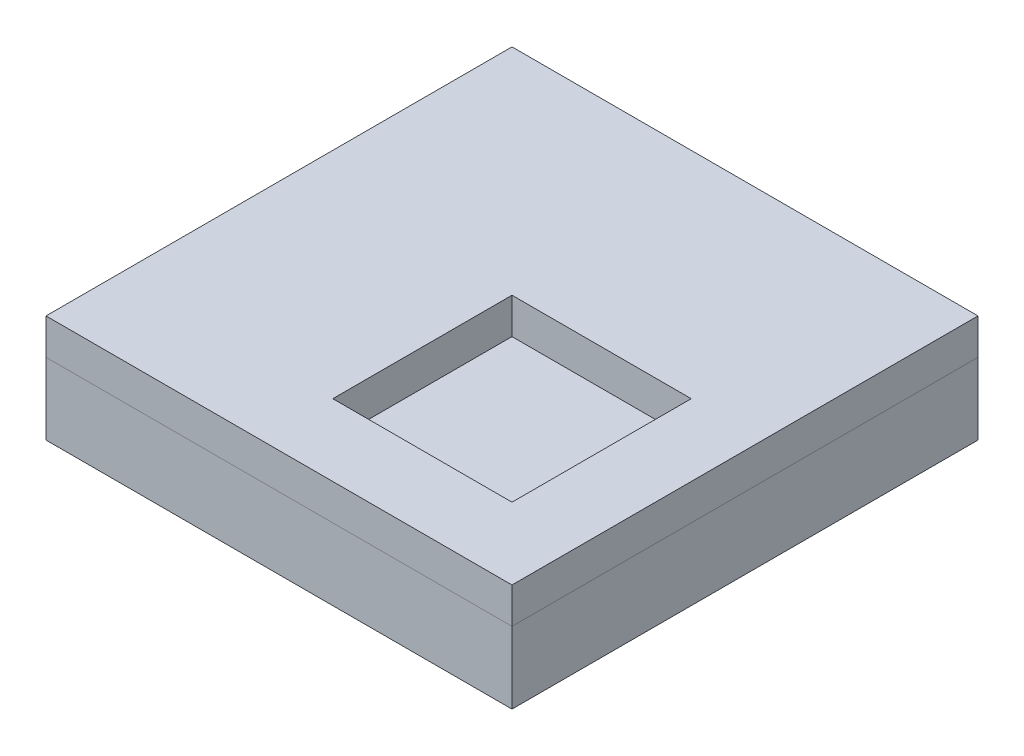
ISO-10303-21;
HEADER;
FILE_DESCRIPTION(('STEP AP214'),'2;1');
FILE_NAME('part.step','',(''),(''),'','','');
FILE_SCHEMA(('AUTOMOTIVE_DESIGN { 1 0 10303 214 1 1 1 1 }'));
ENDSEC;
DATA;
#1=APPLICATION_CONTEXT('core data for automotive mechanical design processes');
#2=APPLICATION_PROTOCOL_DEFINITION('international standard','automotive_design',2000,#1);
#3=PRODUCT_CONTEXT('',#1,'mechanical');
#4=PRODUCT('Part','Part','',(#3));
#5=PRODUCT_RELATED_PRODUCT_CATEGORY('part','',(#4));
#6=PRODUCT_DEFINITION_FORMATION('','',#4);
#7=PRODUCT_DEFINITION_CONTEXT('part definition',#1,'design');
#8=PRODUCT_DEFINITION('design','',#6,#7);
#9=PRODUCT_DEFINITION_SHAPE('','',#8);
#10=(LENGTH_UNIT() NAMED_UNIT(*) SI_UNIT(.MILLI.,.METRE.));
#11=(NAMED_UNIT(*) PLANE_ANGLE_UNIT() SI_UNIT($,.RADIAN.));
#12=(NAMED_UNIT(*) SI_UNIT($,.STERADIAN.) SOLID_ANGLE_UNIT());
#13=UNCERTAINTY_MEASURE_WITH_UNIT(LENGTH_MEASURE(1.E-05),#10,'distance_accuracy_value','');
#14=(GEOMETRIC_REPRESENTATION_CONTEXT(3) GLOBAL_UNCERTAINTY_ASSIGNED_CONTEXT((#13)) GLOBAL_UNIT_ASSIGNED_CONTEXT((#10,
#11,#12)) REPRESENTATION_CONTEXT('',''));
#15=CARTESIAN_POINT('',(0.,0.,0.));
#16=DIRECTION('',(0.,0.,1.));
#17=DIRECTION('',(1.,0.,0.));
#18=AXIS2_PLACEMENT_3D('',#15,#16,#17);
#19=CARTESIAN_POINT('',(0.,3.,0.));
#20=DIRECTION('',(0.,1.,0.));
#21=DIRECTION('',(0.,0.,1.));
#22=AXIS2_PLACEMENT_3D('',#19,#20,#21);
#23=PLANE('',#22);
#24=DIRECTION('',(0.,0.,1.));
#25=VECTOR('',#24,1.);
#26=CARTESIAN_POINT('',(-6.5,3.,6.5));
#27=LINE('',#26,#25);
#28=CARTESIAN_POINT('',(-6.5,3.,-6.5));
#29=VERTEX_POINT('',#28);
#30=CARTESIAN_POINT('',(-6.5,3.,6.5));
#31=VERTEX_POINT('',#30);
#32=EDGE_CURVE('E145',#29,#31,#27,.T.);
#33=ORIENTED_EDGE('',*,*,#32,.T.);
#34=DIRECTION('',(1.,0.,0.));
#35=VECTOR('',#34,1.);
#36=CARTESIAN_POINT('',(6.5,3.,6.5));
#37=LINE('',#36,#35);
#38=CARTESIAN_POINT('',(6.5,3.,6.5));
#39=VERTEX_POINT('',#38);
#40=EDGE_CURVE('E148',#31,#39,#37,.T.);
#41=ORIENTED_EDGE('',*,*,#40,.T.);
#42=DIRECTION('',(0.,0.,-1.));
#43=VECTOR('',#42,1.);
#44=CARTESIAN_POINT('',(6.5,3.,6.5));
#45=LINE('',#44,#43);
#46=CARTESIAN_POINT('',(6.5,3.,-6.5));
#47=VERTEX_POINT('',#46);
#48=EDGE_CURVE('E151',#39,#47,#45,.T.);
#49=ORIENTED_EDGE('',*,*,#48,.T.);
#50=DIRECTION('',(-1.,0.,0.));
#51=VECTOR('',#50,1.);
#52=CARTESIAN_POINT('',(6.5,3.,-6.5));
#53=LINE('',#52,#51);
#54=EDGE_CURVE('E153',#47,#29,#53,.T.);
#55=ORIENTED_EDGE('',*,*,#54,.T.);
#56=EDGE_LOOP('',(#33,#41,#49,#55));
#57=FACE_BOUND('',#56,.T.);
#58=DIRECTION('',(1.,0.,0.));
#59=VECTOR('',#58,1.);
#60=CARTESIAN_POINT('',(0.,3.,-0.500000000000001));
#61=LINE('',#60,#59);
#62=CARTESIAN_POINT('',(-0.499999999999999,3.,-0.500000000000001));
#63=VERTEX_POINT('',#62);
#64=CARTESIAN_POINT('',(4.5,3.,-0.500000000000001));
#65=VERTEX_POINT('',#64);
#66=EDGE_CURVE('E117',#63,#65,#61,.T.);
#67=ORIENTED_EDGE('',*,*,#66,.T.);
#68=DIRECTION('',(0.,0.,1.));
#69=VECTOR('',#68,1.);
#70=CARTESIAN_POINT('',(4.5,3.,0.));
#71=LINE('',#70,#69);
#72=CARTESIAN_POINT('',(4.5,3.,4.5));
#73=VERTEX_POINT('',#72);
#74=EDGE_CURVE('E58',#65,#73,#71,.T.);
#75=ORIENTED_EDGE('',*,*,#74,.T.);
#76=DIRECTION('',(-1.,0.,0.));
#77=VECTOR('',#76,1.);
#78=CARTESIAN_POINT('',(0.,3.,4.5));
#79=LINE('',#78,#77);
#80=CARTESIAN_POINT('',(-0.499999999999998,3.,4.5));
#81=VERTEX_POINT('',#80);
#82=EDGE_CURVE('E123',#73,#81,#79,.T.);
#83=ORIENTED_EDGE('',*,*,#82,.T.);
#84=DIRECTION('',(0.,0.,-1.));
#85=VECTOR('',#84,1.);
#86=CARTESIAN_POINT('',(-0.499999999999999,3.,0.));
#87=LINE('',#86,#85);
#88=EDGE_CURVE('E137',#81,#63,#87,.T.);
#89=ORIENTED_EDGE('',*,*,#88,.T.);
#90=EDGE_LOOP('',(#67,#75,#83,#89));
#91=FACE_BOUND('',#90,.T.);
#92=ADVANCED_FACE('F43',(#57,#91),#23,.T.);
#93=CARTESIAN_POINT('',(0.,2.,0.));
#94=DIRECTION('',(0.,1.,0.));
#95=DIRECTION('',(0.,0.,1.));
#96=AXIS2_PLACEMENT_3D('',#93,#94,#95);
#97=PLANE('',#96);
#98=DIRECTION('',(0.,0.,1.));
#99=VECTOR('',#98,1.);
#100=CARTESIAN_POINT('',(-6.5,2.,6.5));
#101=LINE('',#100,#99);
#102=CARTESIAN_POINT('',(-6.5,2.,-6.5));
#103=VERTEX_POINT('',#102);
#104=CARTESIAN_POINT('',(-6.5,2.,6.5));
#105=VERTEX_POINT('',#104);
#106=EDGE_CURVE('E124',#103,#105,#101,.T.);
#107=ORIENTED_EDGE('',*,*,#106,.F.);
#108=DIRECTION('',(-1.,0.,0.));
#109=VECTOR('',#108,1.);
#110=CARTESIAN_POINT('',(6.5,2.,-6.5));
#111=LINE('',#110,#109);
#112=CARTESIAN_POINT('',(6.5,2.,-6.5));
#113=VERTEX_POINT('',#112);
#114=EDGE_CURVE('E149',#113,#103,#111,.T.);
#115=ORIENTED_EDGE('',*,*,#114,.F.);
#116=DIRECTION('',(0.,0.,-1.));
#117=VECTOR('',#116,1.);
#118=CARTESIAN_POINT('',(6.5,2.,6.5));
#119=LINE('',#118,#117);
#120=CARTESIAN_POINT('',(6.5,2.,6.5));
#121=VERTEX_POINT('',#120);
#122=EDGE_CURVE('E160',#121,#113,#119,.T.);
#123=ORIENTED_EDGE('',*,*,#122,.F.);
#124=DIRECTION('',(1.,0.,0.));
#125=VECTOR('',#124,1.);
#126=CARTESIAN_POINT('',(6.5,2.,6.5));
#127=LINE('',#126,#125);
#128=EDGE_CURVE('E158',#105,#121,#127,.T.);
#129=ORIENTED_EDGE('',*,*,#128,.F.);
#130=EDGE_LOOP('',(#107,#115,#123,#129));
#131=FACE_BOUND('',#130,.T.);
#132=DIRECTION('',(0.,0.,1.));
#133=VECTOR('',#132,1.);
#134=CARTESIAN_POINT('',(4.5,2.,0.));
#135=LINE('',#134,#133);
#136=CARTESIAN_POINT('',(4.5,2.,-0.500000000000001));
#137=VERTEX_POINT('',#136);
#138=CARTESIAN_POINT('',(4.5,2.,4.5));
#139=VERTEX_POINT('',#138);
#140=EDGE_CURVE('E108',#137,#139,#135,.T.);
#141=ORIENTED_EDGE('',*,*,#140,.F.);
#142=DIRECTION('',(1.,0.,0.));
#143=VECTOR('',#142,1.);
#144=CARTESIAN_POINT('',(0.,2.,-0.500000000000001));
#145=LINE('',#144,#143);
#146=CARTESIAN_POINT('',(-0.499999999999999,2.,-0.500000000000001));
#147=VERTEX_POINT('',#146);
#148=EDGE_CURVE('E131',#147,#137,#145,.T.);
#149=ORIENTED_EDGE('',*,*,#148,.F.);
#150=DIRECTION('',(0.,0.,-1.));
#151=VECTOR('',#150,1.);
#152=CARTESIAN_POINT('',(-0.499999999999999,2.,0.));
#153=LINE('',#152,#151);
#154=CARTESIAN_POINT('',(-0.499999999999998,2.,4.5));
#155=VERTEX_POINT('',#154);
#156=EDGE_CURVE('E129',#155,#147,#153,.T.);
#157=ORIENTED_EDGE('',*,*,#156,.F.);
#158=DIRECTION('',(-1.,0.,0.));
#159=VECTOR('',#158,1.);
#160=CARTESIAN_POINT('',(0.,2.,4.5));
#161=LINE('',#160,#159);
#162=EDGE_CURVE('E116',#139,#155,#161,.T.);
#163=ORIENTED_EDGE('',*,*,#162,.F.);
#164=EDGE_LOOP('',(#141,#149,#157,#163));
#165=FACE_BOUND('',#164,.T.);
#166=ADVANCED_FACE('F128',(#131,#165),#97,.F.);
#167=CARTESIAN_POINT('',(-6.5,3.,6.5));
#168=DIRECTION('',(1.,0.,0.));
#169=DIRECTION('',(0.,0.,-1.));
#170=AXIS2_PLACEMENT_3D('',#167,#168,#169);
#171=PLANE('',#170);
#172=ORIENTED_EDGE('',*,*,#106,.T.);
#173=DIRECTION('',(0.,-1.,0.));
#174=VECTOR('',#173,1.);
#175=CARTESIAN_POINT('',(-6.5,3.,6.5));
#176=LINE('',#175,#174);
#177=EDGE_CURVE('E12',#31,#105,#176,.T.);
#178=ORIENTED_EDGE('',*,*,#177,.F.);
#179=ORIENTED_EDGE('',*,*,#32,.F.);
#180=DIRECTION('',(0.,-1.,0.));
#181=VECTOR('',#180,1.);
#182=CARTESIAN_POINT('',(-6.5,3.,-6.5));
#183=LINE('',#182,#181);
#184=EDGE_CURVE('E155',#29,#103,#183,.T.);
#185=ORIENTED_EDGE('',*,*,#184,.T.);
#186=EDGE_LOOP('',(#172,#178,#179,#185));
#187=FACE_BOUND('',#186,.T.);
#188=ADVANCED_FACE('F45',(#187),#171,.F.);
#189=CARTESIAN_POINT('',(6.5,3.,6.5));
#190=DIRECTION('',(0.,0.,-1.));
#191=DIRECTION('',(-1.,0.,0.));
#192=AXIS2_PLACEMENT_3D('',#189,#190,#191);
#193=PLANE('',#192);
#194=ORIENTED_EDGE('',*,*,#128,.T.);
#195=DIRECTION('',(0.,-1.,0.));
#196=VECTOR('',#195,1.);
#197=CARTESIAN_POINT('',(6.5,3.,6.5));
#198=LINE('',#197,#196);
#199=EDGE_CURVE('E51',#39,#121,#198,.T.);
#200=ORIENTED_EDGE('',*,*,#199,.F.);
#201=ORIENTED_EDGE('',*,*,#40,.F.);
#202=ORIENTED_EDGE('',*,*,#177,.T.);
#203=EDGE_LOOP('',(#194,#200,#201,#202));
#204=FACE_BOUND('',#203,.T.);
#205=ADVANCED_FACE('F187',(#204),#193,.F.);
#206=CARTESIAN_POINT('',(6.5,3.,6.5));
#207=DIRECTION('',(-1.,0.,0.));
#208=DIRECTION('',(0.,0.,1.));
#209=AXIS2_PLACEMENT_3D('',#206,#207,#208);
#210=PLANE('',#209);
#211=ORIENTED_EDGE('',*,*,#122,.T.);
#212=DIRECTION('',(0.,-1.,0.));
#213=VECTOR('',#212,1.);
#214=CARTESIAN_POINT('',(6.5,3.,-6.5));
#215=LINE('',#214,#213);
#216=EDGE_CURVE('E165',#47,#113,#215,.T.);
#217=ORIENTED_EDGE('',*,*,#216,.F.);
#218=ORIENTED_EDGE('',*,*,#48,.F.);
#219=ORIENTED_EDGE('',*,*,#199,.T.);
#220=EDGE_LOOP('',(#211,#217,#218,#219));
#221=FACE_BOUND('',#220,.T.);
#222=ADVANCED_FACE('F172',(#221),#210,.F.);
#223=CARTESIAN_POINT('',(6.5,3.,-6.5));
#224=DIRECTION('',(0.,0.,1.));
#225=DIRECTION('',(1.,0.,0.));
#226=AXIS2_PLACEMENT_3D('',#223,#224,#225);
#227=PLANE('',#226);
#228=ORIENTED_EDGE('',*,*,#114,.T.);
#229=ORIENTED_EDGE('',*,*,#184,.F.);
#230=ORIENTED_EDGE('',*,*,#54,.F.);
#231=ORIENTED_EDGE('',*,*,#216,.T.);
#232=EDGE_LOOP('',(#228,#229,#230,#231));
#233=FACE_BOUND('',#232,.T.);
#234=ADVANCED_FACE('F180',(#233),#227,.F.);
#235=CARTESIAN_POINT('',(4.5,2.,0.));
#236=DIRECTION('',(-1.,0.,0.));
#237=DIRECTION('',(0.,0.,1.));
#238=AXIS2_PLACEMENT_3D('',#235,#236,#237);
#239=PLANE('',#238);
#240=ORIENTED_EDGE('',*,*,#74,.F.);
#241=DIRECTION('',(0.,1.,0.));
#242=VECTOR('',#241,1.);
#243=CARTESIAN_POINT('',(4.5,2.,-0.500000000000001));
#244=LINE('',#243,#242);
#245=EDGE_CURVE('E112',#137,#65,#244,.T.);
#246=ORIENTED_EDGE('',*,*,#245,.F.);
#247=ORIENTED_EDGE('',*,*,#140,.T.);
#248=DIRECTION('',(0.,1.,0.));
#249=VECTOR('',#248,1.);
#250=CARTESIAN_POINT('',(4.5,2.,4.5));
#251=LINE('',#250,#249);
#252=EDGE_CURVE('E111',#139,#73,#251,.T.);
#253=ORIENTED_EDGE('',*,*,#252,.T.);
#254=EDGE_LOOP('',(#240,#246,#247,#253));
#255=FACE_BOUND('',#254,.T.);
#256=ADVANCED_FACE('F110',(#255),#239,.T.);
#257=CARTESIAN_POINT('',(0.,2.,4.5));
#258=DIRECTION('',(0.,0.,-1.));
#259=DIRECTION('',(-1.,0.,0.));
#260=AXIS2_PLACEMENT_3D('',#257,#258,#259);
#261=PLANE('',#260);
#262=ORIENTED_EDGE('',*,*,#82,.F.);
#263=ORIENTED_EDGE('',*,*,#252,.F.);
#264=ORIENTED_EDGE('',*,*,#162,.T.);
#265=DIRECTION('',(0.,1.,0.));
#266=VECTOR('',#265,1.);
#267=CARTESIAN_POINT('',(-0.499999999999998,2.,4.5));
#268=LINE('',#267,#266);
#269=EDGE_CURVE('E125',#155,#81,#268,.T.);
#270=ORIENTED_EDGE('',*,*,#269,.T.);
#271=EDGE_LOOP('',(#262,#263,#264,#270));
#272=FACE_BOUND('',#271,.T.);
#273=ADVANCED_FACE('F120',(#272),#261,.T.);
#274=CARTESIAN_POINT('',(-0.499999999999999,2.,0.));
#275=DIRECTION('',(1.,0.,0.));
#276=DIRECTION('',(0.,0.,-1.));
#277=AXIS2_PLACEMENT_3D('',#274,#275,#276);
#278=PLANE('',#277);
#279=ORIENTED_EDGE('',*,*,#88,.F.);
#280=ORIENTED_EDGE('',*,*,#269,.F.);
#281=ORIENTED_EDGE('',*,*,#156,.T.);
#282=DIRECTION('',(0.,1.,0.));
#283=VECTOR('',#282,1.);
#284=CARTESIAN_POINT('',(-0.499999999999999,2.,-0.500000000000001));
#285=LINE('',#284,#283);
#286=EDGE_CURVE('E66',#147,#63,#285,.T.);
#287=ORIENTED_EDGE('',*,*,#286,.T.);
#288=EDGE_LOOP('',(#279,#280,#281,#287));
#289=FACE_BOUND('',#288,.T.);
#290=ADVANCED_FACE('F210',(#289),#278,.T.);
#291=CARTESIAN_POINT('',(0.,2.,-0.500000000000001));
#292=DIRECTION('',(0.,0.,1.));
#293=DIRECTION('',(1.,0.,0.));
#294=AXIS2_PLACEMENT_3D('',#291,#292,#293);
#295=PLANE('',#294);
#296=ORIENTED_EDGE('',*,*,#66,.F.);
#297=ORIENTED_EDGE('',*,*,#286,.F.);
#298=ORIENTED_EDGE('',*,*,#148,.T.);
#299=ORIENTED_EDGE('',*,*,#245,.T.);
#300=EDGE_LOOP('',(#296,#297,#298,#299));
#301=FACE_BOUND('',#300,.T.);
#302=ADVANCED_FACE('F214',(#301),#295,.T.);
#303=CLOSED_SHELL('',(#92,#166,#188,#205,#222,#234,#256,#273,#290,#302));
#304=MANIFOLD_SOLID_BREP('B2',#303);
#305=CARTESIAN_POINT('',(6.5,2.,-6.5));
#306=DIRECTION('',(0.,0.,1.));
#307=DIRECTION('',(1.,0.,0.));
#308=AXIS2_PLACEMENT_3D('',#305,#306,#307);
#309=PLANE('',#308);
#310=DIRECTION('',(0.,1.,0.));
#311=VECTOR('',#310,1.);
#312=CARTESIAN_POINT('',(-5.5,2.,-6.5));
#313=LINE('',#312,#311);
#314=CARTESIAN_POINT('',(-5.5,1.,-6.5));
#315=VERTEX_POINT('',#314);
#316=CARTESIAN_POINT('',(-5.5,2.,-6.5));
#317=VERTEX_POINT('',#316);
#318=EDGE_CURVE('E372',#315,#317,#313,.T.);
#319=ORIENTED_EDGE('',*,*,#318,.F.);
#320=DIRECTION('',(-1.,0.,0.));
#321=VECTOR('',#320,1.);
#322=CARTESIAN_POINT('',(6.5,1.,-6.5));
#323=LINE('',#322,#321);
#324=CARTESIAN_POINT('',(5.5,1.,-6.5));
#325=VERTEX_POINT('',#324);
#326=EDGE_CURVE('E41',#325,#315,#323,.T.);
#327=ORIENTED_EDGE('',*,*,#326,.F.);
#328=DIRECTION('',(0.,-1.,0.));
#329=VECTOR('',#328,1.);
#330=CARTESIAN_POINT('',(5.5,2.,-6.5));
#331=LINE('',#330,#329);
#332=CARTESIAN_POINT('',(5.5,2.,-6.5));
#333=VERTEX_POINT('',#332);
#334=EDGE_CURVE('E363',#333,#325,#331,.T.);
#335=ORIENTED_EDGE('',*,*,#334,.F.);
#336=DIRECTION('',(-1.,0.,0.));
#337=VECTOR('',#336,1.);
#338=CARTESIAN_POINT('',(6.5,2.,-6.5));
#339=LINE('',#338,#337);
#340=CARTESIAN_POINT('',(6.5,2.,-6.5));
#341=VERTEX_POINT('',#340);
#342=EDGE_CURVE('E380',#341,#333,#339,.T.);
#343=ORIENTED_EDGE('',*,*,#342,.F.);
#344=DIRECTION('',(0.,-1.,0.));
#345=VECTOR('',#344,1.);
#346=CARTESIAN_POINT('',(6.5,2.,-6.5));
#347=LINE('',#346,#345);
#348=CARTESIAN_POINT('',(6.5,0.,-6.5));
#349=VERTEX_POINT('',#348);
#350=EDGE_CURVE('E392',#341,#349,#347,.T.);
#351=ORIENTED_EDGE('',*,*,#350,.T.);
#352=DIRECTION('',(-1.,0.,0.));
#353=VECTOR('',#352,1.);
#354=CARTESIAN_POINT('',(6.5,0.,-6.5));
#355=LINE('',#354,#353);
#356=CARTESIAN_POINT('',(-6.5,0.,-6.5));
#357=VERTEX_POINT('',#356);
#358=EDGE_CURVE('E319',#349,#357,#355,.T.);
#359=ORIENTED_EDGE('',*,*,#358,.T.);
#360=DIRECTION('',(0.,-1.,0.));
#361=VECTOR('',#360,1.);
#362=CARTESIAN_POINT('',(-6.5,2.,-6.5));
#363=LINE('',#362,#361);
#364=CARTESIAN_POINT('',(-6.5,2.,-6.5));
#365=VERTEX_POINT('',#364);
#366=EDGE_CURVE('E383',#365,#357,#363,.T.);
#367=ORIENTED_EDGE('',*,*,#366,.F.);
#368=EDGE_CURVE('E297',#317,#365,#339,.T.);
#369=ORIENTED_EDGE('',*,*,#368,.F.);
#370=EDGE_LOOP('',(#319,#327,#335,#343,#351,#359,#367,#369));
#371=FACE_BOUND('',#370,.T.);
#372=ADVANCED_FACE('F273',(#371),#309,.F.);
#373=CARTESIAN_POINT('',(0.,2.,0.));
#374=DIRECTION('',(0.,1.,0.));
#375=DIRECTION('',(0.,0.,1.));
#376=AXIS2_PLACEMENT_3D('',#373,#374,#375);
#377=PLANE('',#376);
#378=DIRECTION('',(-1.,0.,0.));
#379=VECTOR('',#378,1.);
#380=CARTESIAN_POINT('',(0.,2.,5.5));
#381=LINE('',#380,#379);
#382=CARTESIAN_POINT('',(5.5,2.,5.5));
#383=VERTEX_POINT('',#382);
#384=CARTESIAN_POINT('',(-5.5,2.,5.5));
#385=VERTEX_POINT('',#384);
#386=EDGE_CURVE('E402',#383,#385,#381,.T.);
#387=ORIENTED_EDGE('',*,*,#386,.T.);
#388=DIRECTION('',(0.,0.,-1.));
#389=VECTOR('',#388,1.);
#390=CARTESIAN_POINT('',(-5.5,2.,0.));
#391=LINE('',#390,#389);
#392=EDGE_CURVE('E281',#385,#317,#391,.T.);
#393=ORIENTED_EDGE('',*,*,#392,.T.);
#394=ORIENTED_EDGE('',*,*,#368,.T.);
#395=DIRECTION('',(0.,0.,1.));
#396=VECTOR('',#395,1.);
#397=CARTESIAN_POINT('',(-6.5,2.,6.5));
#398=LINE('',#397,#396);
#399=CARTESIAN_POINT('',(-6.5,2.,6.5));
#400=VERTEX_POINT('',#399);
#401=EDGE_CURVE('E375',#365,#400,#398,.T.);
#402=ORIENTED_EDGE('',*,*,#401,.T.);
#403=DIRECTION('',(1.,0.,0.));
#404=VECTOR('',#403,1.);
#405=CARTESIAN_POINT('',(6.5,2.,6.5));
#406=LINE('',#405,#404);
#407=CARTESIAN_POINT('',(6.5,2.,6.5));
#408=VERTEX_POINT('',#407);
#409=EDGE_CURVE('E327',#400,#408,#406,.T.);
#410=ORIENTED_EDGE('',*,*,#409,.T.);
#411=DIRECTION('',(0.,0.,-1.));
#412=VECTOR('',#411,1.);
#413=CARTESIAN_POINT('',(6.5,2.,6.5));
#414=LINE('',#413,#412);
#415=EDGE_CURVE('E378',#408,#341,#414,.T.);
#416=ORIENTED_EDGE('',*,*,#415,.T.);
#417=ORIENTED_EDGE('',*,*,#342,.T.);
#418=DIRECTION('',(0.,0.,1.));
#419=VECTOR('',#418,1.);
#420=CARTESIAN_POINT('',(5.5,2.,0.));
#421=LINE('',#420,#419);
#422=EDGE_CURVE('E399',#333,#383,#421,.T.);
#423=ORIENTED_EDGE('',*,*,#422,.T.);
#424=EDGE_LOOP('',(#387,#393,#394,#402,#410,#416,#417,#423));
#425=FACE_BOUND('',#424,.T.);
#426=ADVANCED_FACE('F403',(#425),#377,.T.);
#427=CARTESIAN_POINT('',(-6.5,2.,6.5));
#428=DIRECTION('',(1.,0.,0.));
#429=DIRECTION('',(0.,0.,-1.));
#430=AXIS2_PLACEMENT_3D('',#427,#428,#429);
#431=PLANE('',#430);
#432=DIRECTION('',(0.,0.,1.));
#433=VECTOR('',#432,1.);
#434=CARTESIAN_POINT('',(-6.5,0.,6.5));
#435=LINE('',#434,#433);
#436=CARTESIAN_POINT('',(-6.5,0.,6.5));
#437=VERTEX_POINT('',#436);
#438=EDGE_CURVE('E374',#357,#437,#435,.T.);
#439=ORIENTED_EDGE('',*,*,#438,.T.);
#440=DIRECTION('',(0.,-1.,0.));
#441=VECTOR('',#440,1.);
#442=CARTESIAN_POINT('',(-6.5,2.,6.5));
#443=LINE('',#442,#441);
#444=EDGE_CURVE('E397',#400,#437,#443,.T.);
#445=ORIENTED_EDGE('',*,*,#444,.F.);
#446=ORIENTED_EDGE('',*,*,#401,.F.);
#447=ORIENTED_EDGE('',*,*,#366,.T.);
#448=EDGE_LOOP('',(#439,#445,#446,#447));
#449=FACE_BOUND('',#448,.T.);
#450=ADVANCED_FACE('F275',(#449),#431,.F.);
#451=CARTESIAN_POINT('',(6.5,2.,6.5));
#452=DIRECTION('',(0.,0.,-1.));
#453=DIRECTION('',(-1.,0.,0.));
#454=AXIS2_PLACEMENT_3D('',#451,#452,#453);
#455=PLANE('',#454);
#456=DIRECTION('',(1.,0.,0.));
#457=VECTOR('',#456,1.);
#458=CARTESIAN_POINT('',(6.5,0.,6.5));
#459=LINE('',#458,#457);
#460=CARTESIAN_POINT('',(6.5,0.,6.5));
#461=VERTEX_POINT('',#460);
#462=EDGE_CURVE('E386',#437,#461,#459,.T.);
#463=ORIENTED_EDGE('',*,*,#462,.T.);
#464=DIRECTION('',(0.,-1.,0.));
#465=VECTOR('',#464,1.);
#466=CARTESIAN_POINT('',(6.5,2.,6.5));
#467=LINE('',#466,#465);
#468=EDGE_CURVE('E394',#408,#461,#467,.T.);
#469=ORIENTED_EDGE('',*,*,#468,.F.);
#470=ORIENTED_EDGE('',*,*,#409,.F.);
#471=ORIENTED_EDGE('',*,*,#444,.T.);
#472=EDGE_LOOP('',(#463,#469,#470,#471));
#473=FACE_BOUND('',#472,.T.);
#474=ADVANCED_FACE('F410',(#473),#455,.F.);
#475=CARTESIAN_POINT('',(6.5,2.,6.5));
#476=DIRECTION('',(-1.,0.,0.));
#477=DIRECTION('',(0.,0.,1.));
#478=AXIS2_PLACEMENT_3D('',#475,#476,#477);
#479=PLANE('',#478);
#480=DIRECTION('',(0.,0.,-1.));
#481=VECTOR('',#480,1.);
#482=CARTESIAN_POINT('',(6.5,0.,6.5));
#483=LINE('',#482,#481);
#484=EDGE_CURVE('E388',#461,#349,#483,.T.);
#485=ORIENTED_EDGE('',*,*,#484,.T.);
#486=ORIENTED_EDGE('',*,*,#350,.F.);
#487=ORIENTED_EDGE('',*,*,#415,.F.);
#488=ORIENTED_EDGE('',*,*,#468,.T.);
#489=EDGE_LOOP('',(#485,#486,#487,#488));
#490=FACE_BOUND('',#489,.T.);
#491=ADVANCED_FACE('F413',(#490),#479,.F.);
#492=CARTESIAN_POINT('',(0.,0.,0.));
#493=DIRECTION('',(0.,1.,0.));
#494=DIRECTION('',(0.,0.,1.));
#495=AXIS2_PLACEMENT_3D('',#492,#493,#494);
#496=PLANE('',#495);
#497=ORIENTED_EDGE('',*,*,#438,.F.);
#498=ORIENTED_EDGE('',*,*,#358,.F.);
#499=ORIENTED_EDGE('',*,*,#484,.F.);
#500=ORIENTED_EDGE('',*,*,#462,.F.);
#501=EDGE_LOOP('',(#497,#498,#499,#500));
#502=FACE_BOUND('',#501,.T.);
#503=ADVANCED_FACE('F434',(#502),#496,.F.);
#504=CARTESIAN_POINT('',(0.,1.,0.));
#505=DIRECTION('',(0.,1.,0.));
#506=DIRECTION('',(0.,0.,1.));
#507=AXIS2_PLACEMENT_3D('',#504,#505,#506);
#508=PLANE('',#507);
#509=ORIENTED_EDGE('',*,*,#326,.T.);
#510=DIRECTION('',(0.,0.,1.));
#511=VECTOR('',#510,1.);
#512=CARTESIAN_POINT('',(-5.5,1.,-9.5));
#513=LINE('',#512,#511);
#514=CARTESIAN_POINT('',(-5.5,1.,5.5));
#515=VERTEX_POINT('',#514);
#516=EDGE_CURVE('E348',#315,#515,#513,.T.);
#517=ORIENTED_EDGE('',*,*,#516,.T.);
#518=DIRECTION('',(1.,0.,0.));
#519=VECTOR('',#518,1.);
#520=CARTESIAN_POINT('',(-5.5,1.,5.5));
#521=LINE('',#520,#519);
#522=CARTESIAN_POINT('',(5.5,1.,5.5));
#523=VERTEX_POINT('',#522);
#524=EDGE_CURVE('E353',#515,#523,#521,.T.);
#525=ORIENTED_EDGE('',*,*,#524,.T.);
#526=DIRECTION('',(0.,0.,-1.));
#527=VECTOR('',#526,1.);
#528=CARTESIAN_POINT('',(5.5,1.,-9.5));
#529=LINE('',#528,#527);
#530=EDGE_CURVE('E366',#523,#325,#529,.T.);
#531=ORIENTED_EDGE('',*,*,#530,.T.);
#532=EDGE_LOOP('',(#509,#517,#525,#531));
#533=FACE_BOUND('',#532,.T.);
#534=ADVANCED_FACE('F350',(#533),#508,.T.);
#535=CARTESIAN_POINT('',(-5.5,4.,-9.5));
#536=DIRECTION('',(1.,0.,0.));
#537=DIRECTION('',(0.,0.,-1.));
#538=AXIS2_PLACEMENT_3D('',#535,#536,#537);
#539=PLANE('',#538);
#540=ORIENTED_EDGE('',*,*,#318,.T.);
#541=ORIENTED_EDGE('',*,*,#392,.F.);
#542=DIRECTION('',(0.,-1.,0.));
#543=VECTOR('',#542,1.);
#544=CARTESIAN_POINT('',(-5.5,4.,5.5));
#545=LINE('',#544,#543);
#546=EDGE_CURVE('E359',#385,#515,#545,.T.);
#547=ORIENTED_EDGE('',*,*,#546,.T.);
#548=ORIENTED_EDGE('',*,*,#516,.F.);
#549=EDGE_LOOP('',(#540,#541,#547,#548));
#550=FACE_BOUND('',#549,.T.);
#551=ADVANCED_FACE('F360',(#550),#539,.T.);
#552=CARTESIAN_POINT('',(5.5,4.,-9.5));
#553=DIRECTION('',(-1.,0.,0.));
#554=DIRECTION('',(0.,0.,1.));
#555=AXIS2_PLACEMENT_3D('',#552,#553,#554);
#556=PLANE('',#555);
#557=ORIENTED_EDGE('',*,*,#334,.T.);
#558=ORIENTED_EDGE('',*,*,#530,.F.);
#559=DIRECTION('',(0.,-1.,0.));
#560=VECTOR('',#559,1.);
#561=CARTESIAN_POINT('',(5.5,4.,5.5));
#562=LINE('',#561,#560);
#563=EDGE_CURVE('E288',#383,#523,#562,.T.);
#564=ORIENTED_EDGE('',*,*,#563,.F.);
#565=ORIENTED_EDGE('',*,*,#422,.F.);
#566=EDGE_LOOP('',(#557,#558,#564,#565));
#567=FACE_BOUND('',#566,.T.);
#568=ADVANCED_FACE('F416',(#567),#556,.T.);
#569=CARTESIAN_POINT('',(-5.5,4.,5.5));
#570=DIRECTION('',(0.,0.,-1.));
#571=DIRECTION('',(-1.,0.,0.));
#572=AXIS2_PLACEMENT_3D('',#569,#570,#571);
#573=PLANE('',#572);
#574=ORIENTED_EDGE('',*,*,#563,.T.);
#575=ORIENTED_EDGE('',*,*,#524,.F.);
#576=ORIENTED_EDGE('',*,*,#546,.F.);
#577=ORIENTED_EDGE('',*,*,#386,.F.);
#578=EDGE_LOOP('',(#574,#575,#576,#577));
#579=FACE_BOUND('',#578,.T.);
#580=ADVANCED_FACE('F365',(#579),#573,.T.);
#581=CLOSED_SHELL('',(#372,#426,#450,#474,#491,#503,#534,#551,#568,#580));
#582=MANIFOLD_SOLID_BREP('B6',#581);
#583=ADVANCED_BREP_SHAPE_REPRESENTATION('',(#18,#304,#582),#14);
#584=SHAPE_DEFINITION_REPRESENTATION(#9,#583);
ENDSEC;
END-ISO-10303-21;
